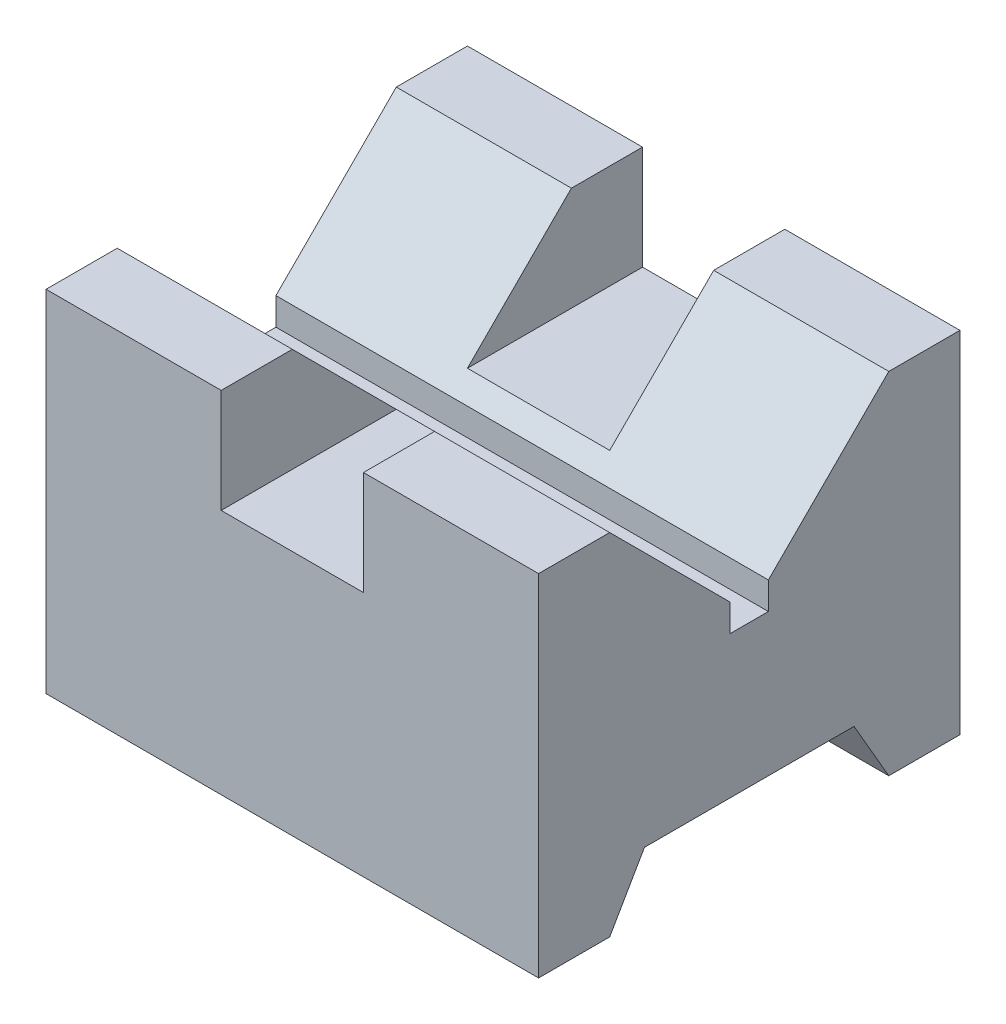
ISO-10303-21;
HEADER;
FILE_DESCRIPTION(('STEP AP214'),'2;1');
FILE_NAME('part.step','',(''),(''),'','','');
FILE_SCHEMA(('AUTOMOTIVE_DESIGN { 1 0 10303 214 1 1 1 1 }'));
ENDSEC;
DATA;
#1=APPLICATION_CONTEXT('core data for automotive mechanical design processes');
#2=APPLICATION_PROTOCOL_DEFINITION('international standard','automotive_design',2000,#1);
#3=PRODUCT_CONTEXT('',#1,'mechanical');
#4=PRODUCT('Part','Part','',(#3));
#5=PRODUCT_RELATED_PRODUCT_CATEGORY('part','',(#4));
#6=PRODUCT_DEFINITION_FORMATION('','',#4);
#7=PRODUCT_DEFINITION_CONTEXT('part definition',#1,'design');
#8=PRODUCT_DEFINITION('design','',#6,#7);
#9=PRODUCT_DEFINITION_SHAPE('','',#8);
#10=(LENGTH_UNIT() NAMED_UNIT(*) SI_UNIT(.MILLI.,.METRE.));
#11=(NAMED_UNIT(*) PLANE_ANGLE_UNIT() SI_UNIT($,.RADIAN.));
#12=(NAMED_UNIT(*) SI_UNIT($,.STERADIAN.) SOLID_ANGLE_UNIT());
#13=UNCERTAINTY_MEASURE_WITH_UNIT(LENGTH_MEASURE(1.E-05),#10,'distance_accuracy_value','');
#14=(GEOMETRIC_REPRESENTATION_CONTEXT(3) GLOBAL_UNCERTAINTY_ASSIGNED_CONTEXT((#13)) GLOBAL_UNIT_ASSIGNED_CONTEXT((#10,
#11,#12)) REPRESENTATION_CONTEXT('',''));
#15=CARTESIAN_POINT('',(0.,0.,0.));
#16=DIRECTION('',(0.,0.,1.));
#17=DIRECTION('',(1.,0.,0.));
#18=AXIS2_PLACEMENT_3D('',#15,#16,#17);
#19=CARTESIAN_POINT('',(-450.,-320.,770.));
#20=DIRECTION('',(0.,1.,0.));
#21=DIRECTION('',(0.,0.,1.));
#22=AXIS2_PLACEMENT_3D('',#19,#20,#21);
#23=PLANE('',#22);
#24=DIRECTION('',(0.,0.,-1.));
#25=VECTOR('',#24,1.);
#26=CARTESIAN_POINT('',(-450.,-320.,770.));
#27=LINE('',#26,#25);
#28=CARTESIAN_POINT('',(-450.,-320.,770.));
#29=VERTEX_POINT('',#28);
#30=CARTESIAN_POINT('',(-450.,-320.,640.));
#31=VERTEX_POINT('',#30);
#32=EDGE_CURVE('E232',#29,#31,#27,.T.);
#33=ORIENTED_EDGE('',*,*,#32,.T.);
#34=DIRECTION('',(1.,0.,0.));
#35=VECTOR('',#34,1.);
#36=CARTESIAN_POINT('',(-971.727898429823,-320.,640.));
#37=LINE('',#36,#35);
#38=CARTESIAN_POINT('',(450.,-320.,640.));
#39=VERTEX_POINT('',#38);
#40=EDGE_CURVE('E666',#31,#39,#37,.T.);
#41=ORIENTED_EDGE('',*,*,#40,.T.);
#42=DIRECTION('',(0.,0.,-1.));
#43=VECTOR('',#42,1.);
#44=CARTESIAN_POINT('',(450.,-320.,770.));
#45=LINE('',#44,#43);
#46=CARTESIAN_POINT('',(450.,-320.,770.));
#47=VERTEX_POINT('',#46);
#48=EDGE_CURVE('E221',#47,#39,#45,.T.);
#49=ORIENTED_EDGE('',*,*,#48,.F.);
#50=DIRECTION('',(1.,0.,0.));
#51=VECTOR('',#50,1.);
#52=CARTESIAN_POINT('',(-450.,-320.,770.));
#53=LINE('',#52,#51);
#54=EDGE_CURVE('E222',#29,#47,#53,.T.);
#55=ORIENTED_EDGE('',*,*,#54,.F.);
#56=EDGE_LOOP('',(#33,#41,#49,#55));
#57=FACE_BOUND('',#56,.T.);
#58=ADVANCED_FACE('F45',(#57),#23,.F.);
#59=CARTESIAN_POINT('',(-450.,320.,770.));
#60=DIRECTION('',(0.,-1.,0.));
#61=DIRECTION('',(0.,0.,-1.));
#62=AXIS2_PLACEMENT_3D('',#59,#60,#61);
#63=PLANE('',#62);
#64=DIRECTION('',(0.,0.,-1.));
#65=VECTOR('',#64,1.);
#66=CARTESIAN_POINT('',(-450.,320.,770.));
#67=LINE('',#66,#65);
#68=CARTESIAN_POINT('',(-450.,320.,130.));
#69=VERTEX_POINT('',#68);
#70=CARTESIAN_POINT('',(-450.,320.,0.));
#71=VERTEX_POINT('',#70);
#72=EDGE_CURVE('E236',#69,#71,#67,.T.);
#73=ORIENTED_EDGE('',*,*,#72,.F.);
#74=DIRECTION('',(1.,0.,0.));
#75=VECTOR('',#74,1.);
#76=CARTESIAN_POINT('',(-1027.06152185014,320.,130.));
#77=LINE('',#76,#75);
#78=CARTESIAN_POINT('',(-130.,320.,130.));
#79=VERTEX_POINT('',#78);
#80=EDGE_CURVE('E390',#69,#79,#77,.T.);
#81=ORIENTED_EDGE('',*,*,#80,.T.);
#82=DIRECTION('',(0.,0.,1.));
#83=VECTOR('',#82,1.);
#84=CARTESIAN_POINT('',(-130.,320.,0.));
#85=LINE('',#84,#83);
#86=CARTESIAN_POINT('',(-130.,320.,0.));
#87=VERTEX_POINT('',#86);
#88=EDGE_CURVE('E290',#87,#79,#85,.T.);
#89=ORIENTED_EDGE('',*,*,#88,.F.);
#90=DIRECTION('',(-1.,0.,0.));
#91=VECTOR('',#90,1.);
#92=CARTESIAN_POINT('',(-450.,320.,0.));
#93=LINE('',#92,#91);
#94=EDGE_CURVE('E289',#87,#71,#93,.T.);
#95=ORIENTED_EDGE('',*,*,#94,.T.);
#96=EDGE_LOOP('',(#73,#81,#89,#95));
#97=FACE_BOUND('',#96,.T.);
#98=ADVANCED_FACE('F364',(#97),#63,.F.);
#99=DIRECTION('',(0.,0.,1.));
#100=VECTOR('',#99,1.);
#101=CARTESIAN_POINT('',(130.,320.,0.));
#102=LINE('',#101,#100);
#103=CARTESIAN_POINT('',(130.,320.,0.));
#104=VERTEX_POINT('',#103);
#105=CARTESIAN_POINT('',(130.,320.,130.));
#106=VERTEX_POINT('',#105);
#107=EDGE_CURVE('E336',#104,#106,#102,.T.);
#108=ORIENTED_EDGE('',*,*,#107,.T.);
#109=CARTESIAN_POINT('',(450.,320.,130.));
#110=VERTEX_POINT('',#109);
#111=EDGE_CURVE('E415',#106,#110,#77,.T.);
#112=ORIENTED_EDGE('',*,*,#111,.T.);
#113=DIRECTION('',(0.,0.,-1.));
#114=VECTOR('',#113,1.);
#115=CARTESIAN_POINT('',(450.,320.,770.));
#116=LINE('',#115,#114);
#117=CARTESIAN_POINT('',(450.,320.,0.));
#118=VERTEX_POINT('',#117);
#119=EDGE_CURVE('E241',#110,#118,#116,.T.);
#120=ORIENTED_EDGE('',*,*,#119,.T.);
#121=EDGE_CURVE('E291',#118,#104,#93,.T.);
#122=ORIENTED_EDGE('',*,*,#121,.T.);
#123=EDGE_LOOP('',(#108,#112,#120,#122));
#124=FACE_BOUND('',#123,.T.);
#125=ADVANCED_FACE('F479',(#124),#63,.F.);
#126=CARTESIAN_POINT('',(-130.,320.,0.));
#127=DIRECTION('',(-1.,0.,0.));
#128=DIRECTION('',(0.,0.,1.));
#129=AXIS2_PLACEMENT_3D('',#126,#127,#128);
#130=PLANE('',#129);
#131=ORIENTED_EDGE('',*,*,#88,.T.);
#132=DIRECTION('',(0.,-0.707106781186549,0.707106781186547));
#133=VECTOR('',#132,1.);
#134=CARTESIAN_POINT('',(-130.,385.,65.0000000000001));
#135=LINE('',#134,#133);
#136=CARTESIAN_POINT('',(-130.,130.,319.999999999999));
#137=VERTEX_POINT('',#136);
#138=EDGE_CURVE('E441',#79,#137,#135,.T.);
#139=ORIENTED_EDGE('',*,*,#138,.T.);
#140=DIRECTION('',(0.,0.,1.));
#141=VECTOR('',#140,1.);
#142=CARTESIAN_POINT('',(-130.,130.,0.));
#143=LINE('',#142,#141);
#144=CARTESIAN_POINT('',(-130.,130.,0.));
#145=VERTEX_POINT('',#144);
#146=EDGE_CURVE('E262',#145,#137,#143,.T.);
#147=ORIENTED_EDGE('',*,*,#146,.F.);
#148=DIRECTION('',(0.,-1.,0.));
#149=VECTOR('',#148,1.);
#150=CARTESIAN_POINT('',(-130.,320.,0.));
#151=LINE('',#150,#149);
#152=EDGE_CURVE('E340',#87,#145,#151,.T.);
#153=ORIENTED_EDGE('',*,*,#152,.F.);
#154=EDGE_LOOP('',(#131,#139,#147,#153));
#155=FACE_BOUND('',#154,.T.);
#156=ADVANCED_FACE('F469',(#155),#130,.F.);
#157=CARTESIAN_POINT('',(130.,130.,0.));
#158=DIRECTION('',(1.,0.,0.));
#159=DIRECTION('',(0.,0.,-1.));
#160=AXIS2_PLACEMENT_3D('',#157,#158,#159);
#161=PLANE('',#160);
#162=DIRECTION('',(0.,0.,1.));
#163=VECTOR('',#162,1.);
#164=CARTESIAN_POINT('',(130.,130.,0.));
#165=LINE('',#164,#163);
#166=CARTESIAN_POINT('',(130.,130.,0.));
#167=VERTEX_POINT('',#166);
#168=CARTESIAN_POINT('',(130.,130.,319.999999999999));
#169=VERTEX_POINT('',#168);
#170=EDGE_CURVE('E273',#167,#169,#165,.T.);
#171=ORIENTED_EDGE('',*,*,#170,.T.);
#172=DIRECTION('',(0.,0.707106781186549,-0.707106781186547));
#173=VECTOR('',#172,1.);
#174=CARTESIAN_POINT('',(130.,290.,160.));
#175=LINE('',#174,#173);
#176=EDGE_CURVE('E437',#169,#106,#175,.T.);
#177=ORIENTED_EDGE('',*,*,#176,.T.);
#178=ORIENTED_EDGE('',*,*,#107,.F.);
#179=DIRECTION('',(0.,1.,0.));
#180=VECTOR('',#179,1.);
#181=CARTESIAN_POINT('',(130.,130.,0.));
#182=LINE('',#181,#180);
#183=EDGE_CURVE('E263',#167,#104,#182,.T.);
#184=ORIENTED_EDGE('',*,*,#183,.F.);
#185=EDGE_LOOP('',(#171,#177,#178,#184));
#186=FACE_BOUND('',#185,.T.);
#187=ADVANCED_FACE('F478',(#186),#161,.F.);
#188=CARTESIAN_POINT('',(-130.,130.,0.));
#189=DIRECTION('',(0.,-1.,0.));
#190=DIRECTION('',(0.,0.,-1.));
#191=AXIS2_PLACEMENT_3D('',#188,#189,#190);
#192=PLANE('',#191);
#193=ORIENTED_EDGE('',*,*,#146,.T.);
#194=DIRECTION('',(1.,0.,0.));
#195=VECTOR('',#194,1.);
#196=CARTESIAN_POINT('',(-130.,130.,319.999999999999));
#197=LINE('',#196,#195);
#198=EDGE_CURVE('E11',#137,#169,#197,.T.);
#199=ORIENTED_EDGE('',*,*,#198,.T.);
#200=ORIENTED_EDGE('',*,*,#170,.F.);
#201=DIRECTION('',(1.,0.,0.));
#202=VECTOR('',#201,1.);
#203=CARTESIAN_POINT('',(-130.,130.,0.));
#204=LINE('',#203,#202);
#205=EDGE_CURVE('E269',#145,#167,#204,.T.);
#206=ORIENTED_EDGE('',*,*,#205,.F.);
#207=EDGE_LOOP('',(#193,#199,#200,#206));
#208=FACE_BOUND('',#207,.T.);
#209=ADVANCED_FACE('F473',(#208),#192,.F.);
#210=CARTESIAN_POINT('',(-130.,320.,640.));
#211=VERTEX_POINT('',#210);
#212=CARTESIAN_POINT('',(-130.,320.,770.));
#213=VERTEX_POINT('',#212);
#214=EDGE_CURVE('E352',#211,#213,#85,.T.);
#215=ORIENTED_EDGE('',*,*,#214,.F.);
#216=DIRECTION('',(1.,0.,0.));
#217=VECTOR('',#216,1.);
#218=CARTESIAN_POINT('',(-1027.06152185014,320.,640.));
#219=LINE('',#218,#217);
#220=CARTESIAN_POINT('',(-450.,320.,640.));
#221=VERTEX_POINT('',#220);
#222=EDGE_CURVE('E310',#221,#211,#219,.T.);
#223=ORIENTED_EDGE('',*,*,#222,.F.);
#224=CARTESIAN_POINT('',(-450.,320.,770.));
#225=VERTEX_POINT('',#224);
#226=EDGE_CURVE('E237',#225,#221,#67,.T.);
#227=ORIENTED_EDGE('',*,*,#226,.F.);
#228=DIRECTION('',(-1.,0.,0.));
#229=VECTOR('',#228,1.);
#230=CARTESIAN_POINT('',(-450.,320.,770.));
#231=LINE('',#230,#229);
#232=EDGE_CURVE('E279',#213,#225,#231,.T.);
#233=ORIENTED_EDGE('',*,*,#232,.F.);
#234=EDGE_LOOP('',(#215,#223,#227,#233));
#235=FACE_BOUND('',#234,.T.);
#236=ADVANCED_FACE('F309',(#235),#63,.F.);
#237=CARTESIAN_POINT('',(450.,320.,770.));
#238=DIRECTION('',(-1.,0.,0.));
#239=DIRECTION('',(0.,-1.,0.));
#240=AXIS2_PLACEMENT_3D('',#237,#238,#239);
#241=PLANE('',#240);
#242=ORIENTED_EDGE('',*,*,#48,.T.);
#243=DIRECTION('',(0.,-0.86602540378444,0.499999999999998));
#244=VECTOR('',#243,1.);
#245=CARTESIAN_POINT('',(450.,-320.,640.));
#246=LINE('',#245,#244);
#247=CARTESIAN_POINT('',(450.,-210.,576.491470389141));
#248=VERTEX_POINT('',#247);
#249=EDGE_CURVE('E204',#248,#39,#246,.T.);
#250=ORIENTED_EDGE('',*,*,#249,.F.);
#251=DIRECTION('',(0.,0.,1.));
#252=VECTOR('',#251,1.);
#253=CARTESIAN_POINT('',(450.,-210.,576.491470389141));
#254=LINE('',#253,#252);
#255=CARTESIAN_POINT('',(450.,-210.,193.508529610859));
#256=VERTEX_POINT('',#255);
#257=EDGE_CURVE('E213',#256,#248,#254,.T.);
#258=ORIENTED_EDGE('',*,*,#257,.F.);
#259=DIRECTION('',(0.,0.86602540378444,0.499999999999998));
#260=VECTOR('',#259,1.);
#261=CARTESIAN_POINT('',(450.,-210.,193.508529610859));
#262=LINE('',#261,#260);
#263=CARTESIAN_POINT('',(450.,-320.,130.));
#264=VERTEX_POINT('',#263);
#265=EDGE_CURVE('E197',#264,#256,#262,.T.);
#266=ORIENTED_EDGE('',*,*,#265,.F.);
#267=CARTESIAN_POINT('',(450.,-320.,0.));
#268=VERTEX_POINT('',#267);
#269=EDGE_CURVE('E209',#264,#268,#45,.T.);
#270=ORIENTED_EDGE('',*,*,#269,.T.);
#271=DIRECTION('',(0.,1.,0.));
#272=VECTOR('',#271,1.);
#273=CARTESIAN_POINT('',(450.,320.,0.));
#274=LINE('',#273,#272);
#275=EDGE_CURVE('E286',#268,#118,#274,.T.);
#276=ORIENTED_EDGE('',*,*,#275,.T.);
#277=ORIENTED_EDGE('',*,*,#119,.F.);
#278=DIRECTION('',(0.,0.707106781186549,-0.707106781186547));
#279=VECTOR('',#278,1.);
#280=CARTESIAN_POINT('',(450.,99.9999999999996,350.));
#281=LINE('',#280,#279);
#282=CARTESIAN_POINT('',(450.,99.9999999999996,350.));
#283=VERTEX_POINT('',#282);
#284=EDGE_CURVE('E372',#283,#110,#281,.T.);
#285=ORIENTED_EDGE('',*,*,#284,.F.);
#286=DIRECTION('',(0.,1.,0.));
#287=VECTOR('',#286,1.);
#288=CARTESIAN_POINT('',(450.,50.,350.));
#289=LINE('',#288,#287);
#290=CARTESIAN_POINT('',(450.,50.,350.));
#291=VERTEX_POINT('',#290);
#292=EDGE_CURVE('E407',#291,#283,#289,.T.);
#293=ORIENTED_EDGE('',*,*,#292,.F.);
#294=DIRECTION('',(0.,0.,-1.));
#295=VECTOR('',#294,1.);
#296=CARTESIAN_POINT('',(450.,50.,420.));
#297=LINE('',#296,#295);
#298=CARTESIAN_POINT('',(450.,50.,420.));
#299=VERTEX_POINT('',#298);
#300=EDGE_CURVE('E403',#299,#291,#297,.T.);
#301=ORIENTED_EDGE('',*,*,#300,.F.);
#302=DIRECTION('',(0.,-1.,0.));
#303=VECTOR('',#302,1.);
#304=CARTESIAN_POINT('',(450.,99.9999999999995,420.));
#305=LINE('',#304,#303);
#306=CARTESIAN_POINT('',(450.,99.9999999999995,420.));
#307=VERTEX_POINT('',#306);
#308=EDGE_CURVE('E381',#307,#299,#305,.T.);
#309=ORIENTED_EDGE('',*,*,#308,.F.);
#310=DIRECTION('',(0.,-0.707106781186548,-0.707106781186547));
#311=VECTOR('',#310,1.);
#312=CARTESIAN_POINT('',(450.,320.,640.));
#313=LINE('',#312,#311);
#314=CARTESIAN_POINT('',(450.,320.,640.));
#315=VERTEX_POINT('',#314);
#316=EDGE_CURVE('E326',#315,#307,#313,.T.);
#317=ORIENTED_EDGE('',*,*,#316,.F.);
#318=CARTESIAN_POINT('',(450.,320.,770.));
#319=VERTEX_POINT('',#318);
#320=EDGE_CURVE('E242',#319,#315,#116,.T.);
#321=ORIENTED_EDGE('',*,*,#320,.F.);
#322=DIRECTION('',(0.,1.,0.));
#323=VECTOR('',#322,1.);
#324=CARTESIAN_POINT('',(450.,320.,770.));
#325=LINE('',#324,#323);
#326=EDGE_CURVE('E275',#47,#319,#325,.T.);
#327=ORIENTED_EDGE('',*,*,#326,.F.);
#328=EDGE_LOOP('',(#242,#250,#258,#266,#270,#276,#277,#285,#293,#301,#309,#317,#321,#327));
#329=FACE_BOUND('',#328,.T.);
#330=ADVANCED_FACE('F47',(#329),#241,.F.);
#331=ORIENTED_EDGE('',*,*,#320,.T.);
#332=CARTESIAN_POINT('',(130.,320.,640.));
#333=VERTEX_POINT('',#332);
#334=EDGE_CURVE('E330',#333,#315,#219,.T.);
#335=ORIENTED_EDGE('',*,*,#334,.F.);
#336=CARTESIAN_POINT('',(130.,320.,770.));
#337=VERTEX_POINT('',#336);
#338=EDGE_CURVE('E332',#333,#337,#102,.T.);
#339=ORIENTED_EDGE('',*,*,#338,.T.);
#340=EDGE_CURVE('E280',#319,#337,#231,.T.);
#341=ORIENTED_EDGE('',*,*,#340,.F.);
#342=EDGE_LOOP('',(#331,#335,#339,#341));
#343=FACE_BOUND('',#342,.T.);
#344=ADVANCED_FACE('F329',(#343),#63,.F.);
#345=CARTESIAN_POINT('',(-450.,320.,770.));
#346=DIRECTION('',(1.,0.,0.));
#347=DIRECTION('',(0.,1.,0.));
#348=AXIS2_PLACEMENT_3D('',#345,#346,#347);
#349=PLANE('',#348);
#350=DIRECTION('',(0.,0.,-1.));
#351=VECTOR('',#350,1.);
#352=CARTESIAN_POINT('',(-450.,-210.,576.491470389141));
#353=LINE('',#352,#351);
#354=CARTESIAN_POINT('',(-450.,-210.,576.491470389141));
#355=VERTEX_POINT('',#354);
#356=CARTESIAN_POINT('',(-450.,-210.,193.508529610859));
#357=VERTEX_POINT('',#356);
#358=EDGE_CURVE('E376',#355,#357,#353,.T.);
#359=ORIENTED_EDGE('',*,*,#358,.F.);
#360=DIRECTION('',(0.,0.86602540378444,-0.499999999999998));
#361=VECTOR('',#360,1.);
#362=CARTESIAN_POINT('',(-450.,-320.,640.));
#363=LINE('',#362,#361);
#364=EDGE_CURVE('E316',#31,#355,#363,.T.);
#365=ORIENTED_EDGE('',*,*,#364,.F.);
#366=ORIENTED_EDGE('',*,*,#32,.F.);
#367=DIRECTION('',(0.,-1.,0.));
#368=VECTOR('',#367,1.);
#369=CARTESIAN_POINT('',(-450.,320.,770.));
#370=LINE('',#369,#368);
#371=EDGE_CURVE('E227',#225,#29,#370,.T.);
#372=ORIENTED_EDGE('',*,*,#371,.F.);
#373=ORIENTED_EDGE('',*,*,#226,.T.);
#374=DIRECTION('',(0.,0.707106781186549,0.707106781186547));
#375=VECTOR('',#374,1.);
#376=CARTESIAN_POINT('',(-450.,320.,640.));
#377=LINE('',#376,#375);
#378=CARTESIAN_POINT('',(-450.,99.9999999999993,420.));
#379=VERTEX_POINT('',#378);
#380=EDGE_CURVE('E398',#379,#221,#377,.T.);
#381=ORIENTED_EDGE('',*,*,#380,.F.);
#382=DIRECTION('',(0.,1.,0.));
#383=VECTOR('',#382,1.);
#384=CARTESIAN_POINT('',(-450.,99.9999999999992,420.));
#385=LINE('',#384,#383);
#386=CARTESIAN_POINT('',(-450.,49.9999999999997,420.));
#387=VERTEX_POINT('',#386);
#388=EDGE_CURVE('E386',#387,#379,#385,.T.);
#389=ORIENTED_EDGE('',*,*,#388,.F.);
#390=DIRECTION('',(0.,0.,1.));
#391=VECTOR('',#390,1.);
#392=CARTESIAN_POINT('',(-450.,49.9999999999998,420.));
#393=LINE('',#392,#391);
#394=CARTESIAN_POINT('',(-450.,49.9999999999998,350.));
#395=VERTEX_POINT('',#394);
#396=EDGE_CURVE('E389',#395,#387,#393,.T.);
#397=ORIENTED_EDGE('',*,*,#396,.F.);
#398=DIRECTION('',(0.,-1.,0.));
#399=VECTOR('',#398,1.);
#400=CARTESIAN_POINT('',(-450.,49.9999999999998,350.));
#401=LINE('',#400,#399);
#402=CARTESIAN_POINT('',(-450.,99.9999999999996,350.));
#403=VERTEX_POINT('',#402);
#404=EDGE_CURVE('E393',#403,#395,#401,.T.);
#405=ORIENTED_EDGE('',*,*,#404,.F.);
#406=DIRECTION('',(0.,-0.707106781186549,0.707106781186547));
#407=VECTOR('',#406,1.);
#408=CARTESIAN_POINT('',(-450.,99.9999999999994,350.));
#409=LINE('',#408,#407);
#410=EDGE_CURVE('E396',#69,#403,#409,.T.);
#411=ORIENTED_EDGE('',*,*,#410,.F.);
#412=ORIENTED_EDGE('',*,*,#72,.T.);
#413=DIRECTION('',(0.,-1.,0.));
#414=VECTOR('',#413,1.);
#415=CARTESIAN_POINT('',(-450.,320.,0.));
#416=LINE('',#415,#414);
#417=CARTESIAN_POINT('',(-450.,-320.,0.));
#418=VERTEX_POINT('',#417);
#419=EDGE_CURVE('E294',#71,#418,#416,.T.);
#420=ORIENTED_EDGE('',*,*,#419,.T.);
#421=CARTESIAN_POINT('',(-450.,-320.,130.));
#422=VERTEX_POINT('',#421);
#423=EDGE_CURVE('E226',#422,#418,#27,.T.);
#424=ORIENTED_EDGE('',*,*,#423,.F.);
#425=DIRECTION('',(0.,-0.86602540378444,-0.499999999999998));
#426=VECTOR('',#425,1.);
#427=CARTESIAN_POINT('',(-450.,-210.,193.508529610858));
#428=LINE('',#427,#426);
#429=EDGE_CURVE('E61',#357,#422,#428,.T.);
#430=ORIENTED_EDGE('',*,*,#429,.F.);
#431=EDGE_LOOP('',(#359,#365,#366,#372,#373,#381,#389,#397,#405,#411,#412,#420,#424,#430));
#432=FACE_BOUND('',#431,.T.);
#433=ADVANCED_FACE('F313',(#432),#349,.F.);
#434=ORIENTED_EDGE('',*,*,#269,.F.);
#435=DIRECTION('',(1.,0.,0.));
#436=VECTOR('',#435,1.);
#437=CARTESIAN_POINT('',(-971.727898429823,-320.,130.));
#438=LINE('',#437,#436);
#439=EDGE_CURVE('E194',#422,#264,#438,.T.);
#440=ORIENTED_EDGE('',*,*,#439,.F.);
#441=ORIENTED_EDGE('',*,*,#423,.T.);
#442=DIRECTION('',(1.,0.,0.));
#443=VECTOR('',#442,1.);
#444=CARTESIAN_POINT('',(-450.,-320.,0.));
#445=LINE('',#444,#443);
#446=EDGE_CURVE('E218',#418,#268,#445,.T.);
#447=ORIENTED_EDGE('',*,*,#446,.T.);
#448=EDGE_LOOP('',(#434,#440,#441,#447));
#449=FACE_BOUND('',#448,.T.);
#450=ADVANCED_FACE('F216',(#449),#23,.F.);
#451=CARTESIAN_POINT('',(0.,0.,770.));
#452=DIRECTION('',(0.,0.,1.));
#453=DIRECTION('',(1.,0.,0.));
#454=AXIS2_PLACEMENT_3D('',#451,#452,#453);
#455=PLANE('',#454);
#456=DIRECTION('',(0.,-1.,0.));
#457=VECTOR('',#456,1.);
#458=CARTESIAN_POINT('',(-130.,320.,770.));
#459=LINE('',#458,#457);
#460=CARTESIAN_POINT('',(-130.,130.,770.));
#461=VERTEX_POINT('',#460);
#462=EDGE_CURVE('E259',#213,#461,#459,.T.);
#463=ORIENTED_EDGE('',*,*,#462,.F.);
#464=ORIENTED_EDGE('',*,*,#232,.T.);
#465=ORIENTED_EDGE('',*,*,#371,.T.);
#466=ORIENTED_EDGE('',*,*,#54,.T.);
#467=ORIENTED_EDGE('',*,*,#326,.T.);
#468=ORIENTED_EDGE('',*,*,#340,.T.);
#469=DIRECTION('',(0.,1.,0.));
#470=VECTOR('',#469,1.);
#471=CARTESIAN_POINT('',(130.,130.,770.));
#472=LINE('',#471,#470);
#473=CARTESIAN_POINT('',(130.,130.,770.));
#474=VERTEX_POINT('',#473);
#475=EDGE_CURVE('E337',#474,#337,#472,.T.);
#476=ORIENTED_EDGE('',*,*,#475,.F.);
#477=DIRECTION('',(1.,0.,0.));
#478=VECTOR('',#477,1.);
#479=CARTESIAN_POINT('',(-130.,130.,770.));
#480=LINE('',#479,#478);
#481=EDGE_CURVE('E341',#461,#474,#480,.T.);
#482=ORIENTED_EDGE('',*,*,#481,.F.);
#483=EDGE_LOOP('',(#463,#464,#465,#466,#467,#468,#476,#482));
#484=FACE_BOUND('',#483,.T.);
#485=ADVANCED_FACE('F304',(#484),#455,.T.);
#486=CARTESIAN_POINT('',(0.,0.,0.));
#487=DIRECTION('',(0.,0.,1.));
#488=DIRECTION('',(1.,0.,0.));
#489=AXIS2_PLACEMENT_3D('',#486,#487,#488);
#490=PLANE('',#489);
#491=ORIENTED_EDGE('',*,*,#94,.F.);
#492=ORIENTED_EDGE('',*,*,#152,.T.);
#493=ORIENTED_EDGE('',*,*,#205,.T.);
#494=ORIENTED_EDGE('',*,*,#183,.T.);
#495=ORIENTED_EDGE('',*,*,#121,.F.);
#496=ORIENTED_EDGE('',*,*,#275,.F.);
#497=ORIENTED_EDGE('',*,*,#446,.F.);
#498=ORIENTED_EDGE('',*,*,#419,.F.);
#499=EDGE_LOOP('',(#491,#492,#493,#494,#495,#496,#497,#498));
#500=FACE_BOUND('',#499,.T.);
#501=ADVANCED_FACE('F367',(#500),#490,.F.);
#502=CARTESIAN_POINT('',(-130.,130.,450.000000000001));
#503=VERTEX_POINT('',#502);
#504=EDGE_CURVE('E251',#503,#461,#143,.T.);
#505=ORIENTED_EDGE('',*,*,#504,.F.);
#506=DIRECTION('',(0.,0.707106781186549,0.707106781186547));
#507=VECTOR('',#506,1.);
#508=CARTESIAN_POINT('',(-130.,0.,320.000000000001));
#509=LINE('',#508,#507);
#510=EDGE_CURVE('E69',#503,#211,#509,.T.);
#511=ORIENTED_EDGE('',*,*,#510,.T.);
#512=ORIENTED_EDGE('',*,*,#214,.T.);
#513=ORIENTED_EDGE('',*,*,#462,.T.);
#514=EDGE_LOOP('',(#505,#511,#512,#513));
#515=FACE_BOUND('',#514,.T.);
#516=ADVANCED_FACE('F256',(#515),#130,.F.);
#517=ORIENTED_EDGE('',*,*,#338,.F.);
#518=DIRECTION('',(0.,-0.707106781186549,-0.707106781186547));
#519=VECTOR('',#518,1.);
#520=CARTESIAN_POINT('',(130.,-95.0000000000003,225.000000000001));
#521=LINE('',#520,#519);
#522=CARTESIAN_POINT('',(130.,130.,450.000000000001));
#523=VERTEX_POINT('',#522);
#524=EDGE_CURVE('E432',#333,#523,#521,.T.);
#525=ORIENTED_EDGE('',*,*,#524,.T.);
#526=EDGE_CURVE('E253',#523,#474,#165,.T.);
#527=ORIENTED_EDGE('',*,*,#526,.T.);
#528=ORIENTED_EDGE('',*,*,#475,.T.);
#529=EDGE_LOOP('',(#517,#525,#527,#528));
#530=FACE_BOUND('',#529,.T.);
#531=ADVANCED_FACE('F338',(#530),#161,.F.);
#532=ORIENTED_EDGE('',*,*,#526,.F.);
#533=DIRECTION('',(-1.,0.,0.));
#534=VECTOR('',#533,1.);
#535=CARTESIAN_POINT('',(-130.,130.,450.000000000001));
#536=LINE('',#535,#534);
#537=EDGE_CURVE('E54',#523,#503,#536,.T.);
#538=ORIENTED_EDGE('',*,*,#537,.T.);
#539=ORIENTED_EDGE('',*,*,#504,.T.);
#540=ORIENTED_EDGE('',*,*,#481,.T.);
#541=EDGE_LOOP('',(#532,#538,#539,#540));
#542=FACE_BOUND('',#541,.T.);
#543=ADVANCED_FACE('F249',(#542),#192,.F.);
#544=CARTESIAN_POINT('',(-1027.06152185014,99.9999999999992,350.));
#545=DIRECTION('',(0.,-0.707106781186547,-0.707106781186549));
#546=DIRECTION('',(0.,0.707106781186549,-0.707106781186547));
#547=AXIS2_PLACEMENT_3D('',#544,#545,#546);
#548=PLANE('',#547);
#549=ORIENTED_EDGE('',*,*,#80,.F.);
#550=ORIENTED_EDGE('',*,*,#410,.T.);
#551=DIRECTION('',(1.,0.,0.));
#552=VECTOR('',#551,1.);
#553=CARTESIAN_POINT('',(-1027.06152185014,99.9999999999992,350.));
#554=LINE('',#553,#552);
#555=EDGE_CURVE('E416',#403,#283,#554,.T.);
#556=ORIENTED_EDGE('',*,*,#555,.T.);
#557=ORIENTED_EDGE('',*,*,#284,.T.);
#558=ORIENTED_EDGE('',*,*,#111,.F.);
#559=ORIENTED_EDGE('',*,*,#176,.F.);
#560=ORIENTED_EDGE('',*,*,#198,.F.);
#561=ORIENTED_EDGE('',*,*,#138,.F.);
#562=EDGE_LOOP('',(#549,#550,#556,#557,#558,#559,#560,#561));
#563=FACE_BOUND('',#562,.T.);
#564=ADVANCED_FACE('F467',(#563),#548,.F.);
#565=CARTESIAN_POINT('',(-1027.06152185014,320.,640.));
#566=DIRECTION('',(0.,-0.707106781186547,0.707106781186549));
#567=DIRECTION('',(0.,-0.707106781186549,-0.707106781186547));
#568=AXIS2_PLACEMENT_3D('',#565,#566,#567);
#569=PLANE('',#568);
#570=ORIENTED_EDGE('',*,*,#537,.F.);
#571=ORIENTED_EDGE('',*,*,#524,.F.);
#572=ORIENTED_EDGE('',*,*,#334,.T.);
#573=ORIENTED_EDGE('',*,*,#316,.T.);
#574=DIRECTION('',(1.,0.,0.));
#575=VECTOR('',#574,1.);
#576=CARTESIAN_POINT('',(-1027.06152185014,99.9999999999991,420.));
#577=LINE('',#576,#575);
#578=EDGE_CURVE('E425',#379,#307,#577,.T.);
#579=ORIENTED_EDGE('',*,*,#578,.F.);
#580=ORIENTED_EDGE('',*,*,#380,.T.);
#581=ORIENTED_EDGE('',*,*,#222,.T.);
#582=ORIENTED_EDGE('',*,*,#510,.F.);
#583=EDGE_LOOP('',(#570,#571,#572,#573,#579,#580,#581,#582));
#584=FACE_BOUND('',#583,.T.);
#585=ADVANCED_FACE('F450',(#584),#569,.F.);
#586=CARTESIAN_POINT('',(-1027.06152185014,49.9999999999997,350.));
#587=DIRECTION('',(0.,0.,-1.));
#588=DIRECTION('',(0.,1.,0.));
#589=AXIS2_PLACEMENT_3D('',#586,#587,#588);
#590=PLANE('',#589);
#591=ORIENTED_EDGE('',*,*,#404,.T.);
#592=DIRECTION('',(1.,0.,0.));
#593=VECTOR('',#592,1.);
#594=CARTESIAN_POINT('',(-1027.06152185014,49.9999999999997,350.));
#595=LINE('',#594,#593);
#596=EDGE_CURVE('E419',#395,#291,#595,.T.);
#597=ORIENTED_EDGE('',*,*,#596,.T.);
#598=ORIENTED_EDGE('',*,*,#292,.T.);
#599=ORIENTED_EDGE('',*,*,#555,.F.);
#600=EDGE_LOOP('',(#591,#597,#598,#599));
#601=FACE_BOUND('',#600,.T.);
#602=ADVANCED_FACE('F464',(#601),#590,.F.);
#603=CARTESIAN_POINT('',(-1027.06152185014,49.9999999999997,420.));
#604=DIRECTION('',(0.,-1.,0.));
#605=DIRECTION('',(1.,0.,0.));
#606=AXIS2_PLACEMENT_3D('',#603,#604,#605);
#607=PLANE('',#606);
#608=ORIENTED_EDGE('',*,*,#396,.T.);
#609=DIRECTION('',(1.,0.,0.));
#610=VECTOR('',#609,1.);
#611=CARTESIAN_POINT('',(-1027.06152185014,49.9999999999997,420.));
#612=LINE('',#611,#610);
#613=EDGE_CURVE('E422',#387,#299,#612,.T.);
#614=ORIENTED_EDGE('',*,*,#613,.T.);
#615=ORIENTED_EDGE('',*,*,#300,.T.);
#616=ORIENTED_EDGE('',*,*,#596,.F.);
#617=EDGE_LOOP('',(#608,#614,#615,#616));
#618=FACE_BOUND('',#617,.T.);
#619=ADVANCED_FACE('F462',(#618),#607,.F.);
#620=CARTESIAN_POINT('',(-1027.06152185014,99.9999999999991,420.));
#621=DIRECTION('',(0.,0.,1.));
#622=DIRECTION('',(1.,0.,0.));
#623=AXIS2_PLACEMENT_3D('',#620,#621,#622);
#624=PLANE('',#623);
#625=ORIENTED_EDGE('',*,*,#388,.T.);
#626=ORIENTED_EDGE('',*,*,#578,.T.);
#627=ORIENTED_EDGE('',*,*,#308,.T.);
#628=ORIENTED_EDGE('',*,*,#613,.F.);
#629=EDGE_LOOP('',(#625,#626,#627,#628));
#630=FACE_BOUND('',#629,.T.);
#631=ADVANCED_FACE('F455',(#630),#624,.F.);
#632=CARTESIAN_POINT('',(-971.727898429823,-320.,640.));
#633=DIRECTION('',(0.,0.499999999999998,0.86602540378444));
#634=DIRECTION('',(0.,-0.86602540378444,0.499999999999998));
#635=AXIS2_PLACEMENT_3D('',#632,#633,#634);
#636=PLANE('',#635);
#637=ORIENTED_EDGE('',*,*,#364,.T.);
#638=DIRECTION('',(1.,0.,0.));
#639=VECTOR('',#638,1.);
#640=CARTESIAN_POINT('',(-971.727898429823,-210.,576.491470389141));
#641=LINE('',#640,#639);
#642=EDGE_CURVE('E664',#355,#248,#641,.T.);
#643=ORIENTED_EDGE('',*,*,#642,.T.);
#644=ORIENTED_EDGE('',*,*,#249,.T.);
#645=ORIENTED_EDGE('',*,*,#40,.F.);
#646=EDGE_LOOP('',(#637,#643,#644,#645));
#647=FACE_BOUND('',#646,.T.);
#648=ADVANCED_FACE('F630',(#647),#636,.F.);
#649=CARTESIAN_POINT('',(-971.727898429823,-210.,576.491470389141));
#650=DIRECTION('',(0.,1.,0.));
#651=DIRECTION('',(-1.,0.,0.));
#652=AXIS2_PLACEMENT_3D('',#649,#650,#651);
#653=PLANE('',#652);
#654=ORIENTED_EDGE('',*,*,#358,.T.);
#655=DIRECTION('',(1.,0.,0.));
#656=VECTOR('',#655,1.);
#657=CARTESIAN_POINT('',(-971.727898429823,-210.,193.508529610859));
#658=LINE('',#657,#656);
#659=EDGE_CURVE('E203',#357,#256,#658,.T.);
#660=ORIENTED_EDGE('',*,*,#659,.T.);
#661=ORIENTED_EDGE('',*,*,#257,.T.);
#662=ORIENTED_EDGE('',*,*,#642,.F.);
#663=EDGE_LOOP('',(#654,#660,#661,#662));
#664=FACE_BOUND('',#663,.T.);
#665=ADVANCED_FACE('F642',(#664),#653,.F.);
#666=CARTESIAN_POINT('',(-971.727898429823,-210.,193.508529610859));
#667=DIRECTION('',(0.,0.499999999999998,-0.86602540378444));
#668=DIRECTION('',(0.,0.86602540378444,0.499999999999998));
#669=AXIS2_PLACEMENT_3D('',#666,#667,#668);
#670=PLANE('',#669);
#671=ORIENTED_EDGE('',*,*,#429,.T.);
#672=ORIENTED_EDGE('',*,*,#439,.T.);
#673=ORIENTED_EDGE('',*,*,#265,.T.);
#674=ORIENTED_EDGE('',*,*,#659,.F.);
#675=EDGE_LOOP('',(#671,#672,#673,#674));
#676=FACE_BOUND('',#675,.T.);
#677=ADVANCED_FACE('F196',(#676),#670,.F.);
#678=CLOSED_SHELL('',(#58,#98,#125,#156,#187,#209,#236,#330,#344,#433,#450,#485,#501,#516,#531,
#543,#564,#585,#602,#619,#631,#648,#665,#677));
#679=MANIFOLD_SOLID_BREP('B2',#678);
#680=ADVANCED_BREP_SHAPE_REPRESENTATION('',(#18,#679),#14);
#681=SHAPE_DEFINITION_REPRESENTATION(#9,#680);
ENDSEC;
END-ISO-10303-21;
